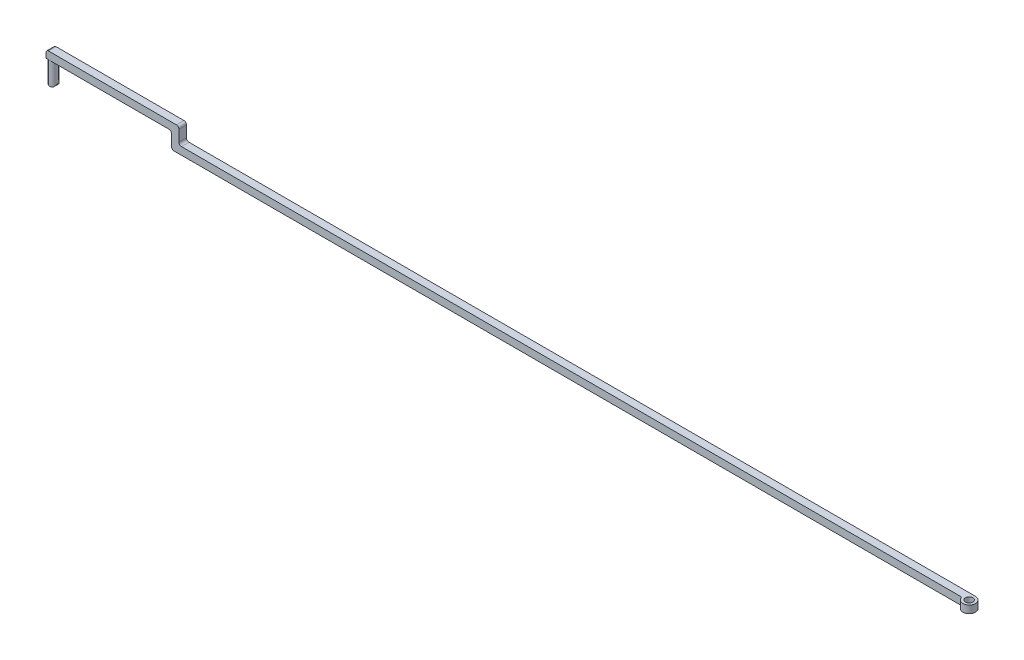
ISO-10303-21;
HEADER;
FILE_DESCRIPTION(('STEP AP214'),'2;1');
FILE_NAME('part.step','',(''),(''),'','','');
FILE_SCHEMA(('AUTOMOTIVE_DESIGN { 1 0 10303 214 1 1 1 1 }'));
ENDSEC;
DATA;
#1=APPLICATION_CONTEXT('core data for automotive mechanical design processes');
#2=APPLICATION_PROTOCOL_DEFINITION('international standard','automotive_design',2000,#1);
#3=PRODUCT_CONTEXT('',#1,'mechanical');
#4=PRODUCT('Part','Part','',(#3));
#5=PRODUCT_RELATED_PRODUCT_CATEGORY('part','',(#4));
#6=PRODUCT_DEFINITION_FORMATION('','',#4);
#7=PRODUCT_DEFINITION_CONTEXT('part definition',#1,'design');
#8=PRODUCT_DEFINITION('design','',#6,#7);
#9=PRODUCT_DEFINITION_SHAPE('','',#8);
#10=(LENGTH_UNIT() NAMED_UNIT(*) SI_UNIT(.MILLI.,.METRE.));
#11=(NAMED_UNIT(*) PLANE_ANGLE_UNIT() SI_UNIT($,.RADIAN.));
#12=(NAMED_UNIT(*) SI_UNIT($,.STERADIAN.) SOLID_ANGLE_UNIT());
#13=UNCERTAINTY_MEASURE_WITH_UNIT(LENGTH_MEASURE(1.E-05),#10,'distance_accuracy_value','');
#14=(GEOMETRIC_REPRESENTATION_CONTEXT(3) GLOBAL_UNCERTAINTY_ASSIGNED_CONTEXT((#13)) GLOBAL_UNIT_ASSIGNED_CONTEXT((#10,
#11,#12)) REPRESENTATION_CONTEXT('',''));
#15=CARTESIAN_POINT('',(0.,0.,0.));
#16=DIRECTION('',(0.,0.,1.));
#17=DIRECTION('',(1.,0.,0.));
#18=AXIS2_PLACEMENT_3D('',#15,#16,#17);
#19=CARTESIAN_POINT('',(-185.,0.,1.5));
#20=DIRECTION('',(1.,0.,0.));
#21=DIRECTION('',(0.,0.,-1.));
#22=AXIS2_PLACEMENT_3D('',#19,#20,#21);
#23=PLANE('',#22);
#24=DIRECTION('',(0.,0.,-1.));
#25=VECTOR('',#24,1.);
#26=CARTESIAN_POINT('',(-185.,4.49999999999999,1.5));
#27=LINE('',#26,#25);
#28=CARTESIAN_POINT('',(-185.,4.49999999999999,1.5));
#29=VERTEX_POINT('',#28);
#30=CARTESIAN_POINT('',(-185.,4.49999999999999,0.75));
#31=VERTEX_POINT('',#30);
#32=EDGE_CURVE('E349',#29,#31,#27,.T.);
#33=ORIENTED_EDGE('',*,*,#32,.F.);
#34=DIRECTION('',(0.,-1.,0.));
#35=VECTOR('',#34,1.);
#36=CARTESIAN_POINT('',(-185.,0.,1.5));
#37=LINE('',#36,#35);
#38=CARTESIAN_POINT('',(-185.,5.49999999999998,1.5));
#39=VERTEX_POINT('',#38);
#40=EDGE_CURVE('E263',#39,#29,#37,.T.);
#41=ORIENTED_EDGE('',*,*,#40,.F.);
#42=DIRECTION('',(0.,0.,1.));
#43=VECTOR('',#42,1.);
#44=CARTESIAN_POINT('',(-185.,5.49999999999998,0.));
#45=LINE('',#44,#43);
#46=CARTESIAN_POINT('',(-185.,5.49999999999998,0.));
#47=VERTEX_POINT('',#46);
#48=EDGE_CURVE('E239',#47,#39,#45,.T.);
#49=ORIENTED_EDGE('',*,*,#48,.F.);
#50=DIRECTION('',(0.,-1.,0.));
#51=VECTOR('',#50,1.);
#52=CARTESIAN_POINT('',(-185.,0.,0.));
#53=LINE('',#52,#51);
#54=CARTESIAN_POINT('',(-185.,4.49999999999999,0.));
#55=VERTEX_POINT('',#54);
#56=EDGE_CURVE('E264',#47,#55,#53,.T.);
#57=ORIENTED_EDGE('',*,*,#56,.T.);
#58=EDGE_CURVE('E346',#31,#55,#27,.T.);
#59=ORIENTED_EDGE('',*,*,#58,.F.);
#60=EDGE_LOOP('',(#33,#41,#49,#57,#59));
#61=FACE_BOUND('',#60,.T.);
#62=ADVANCED_FACE('F34',(#61),#23,.F.);
#63=CARTESIAN_POINT('',(0.,0.,1.5));
#64=DIRECTION('',(0.,0.,1.));
#65=DIRECTION('',(1.,0.,0.));
#66=AXIS2_PLACEMENT_3D('',#63,#64,#65);
#67=PLANE('',#66);
#68=DIRECTION('',(0.,1.,0.));
#69=VECTOR('',#68,1.);
#70=CARTESIAN_POINT('',(-2.44948974278318,-2.28553390593276,1.5));
#71=LINE('',#70,#69);
#72=CARTESIAN_POINT('',(-2.44948974278318,2.74999999999998,1.5));
#73=VERTEX_POINT('',#72);
#74=CARTESIAN_POINT('',(-2.44948974278318,1.24999999999998,1.5));
#75=VERTEX_POINT('',#74);
#76=EDGE_CURVE('E166',#73,#75,#71,.F.);
#77=ORIENTED_EDGE('',*,*,#76,.F.);
#78=DIRECTION('',(-1.,0.,0.));
#79=VECTOR('',#78,1.);
#80=CARTESIAN_POINT('',(-158.,2.74999999999998,1.5));
#81=LINE('',#80,#79);
#82=CARTESIAN_POINT('',(-158.,2.74999999999998,1.5));
#83=VERTEX_POINT('',#82);
#84=EDGE_CURVE('E217',#73,#83,#81,.T.);
#85=ORIENTED_EDGE('',*,*,#84,.T.);
#86=CARTESIAN_POINT('',(-158.,3.24999999999998,1.5));
#87=DIRECTION('',(0.,0.,-1.));
#88=DIRECTION('',(-1.,0.,0.));
#89=AXIS2_PLACEMENT_3D('',#86,#87,#88);
#90=CIRCLE('',#89,0.5);
#91=CARTESIAN_POINT('',(-158.5,3.24999999999998,1.5));
#92=VERTEX_POINT('',#91);
#93=EDGE_CURVE('E219',#83,#92,#90,.T.);
#94=ORIENTED_EDGE('',*,*,#93,.T.);
#95=DIRECTION('',(0.,1.,0.));
#96=VECTOR('',#95,1.);
#97=CARTESIAN_POINT('',(-158.5,5.49999999999998,1.5));
#98=LINE('',#97,#96);
#99=CARTESIAN_POINT('',(-158.5,5.49999999999998,1.5));
#100=VERTEX_POINT('',#99);
#101=EDGE_CURVE('E222',#92,#100,#98,.T.);
#102=ORIENTED_EDGE('',*,*,#101,.T.);
#103=CARTESIAN_POINT('',(-159.,5.49999999999998,1.5));
#104=DIRECTION('',(0.,0.,1.));
#105=DIRECTION('',(-1.,0.,0.));
#106=AXIS2_PLACEMENT_3D('',#103,#104,#105);
#107=CIRCLE('',#106,0.5);
#108=CARTESIAN_POINT('',(-159.,5.99999999999998,1.5));
#109=VERTEX_POINT('',#108);
#110=EDGE_CURVE('E225',#100,#109,#107,.T.);
#111=ORIENTED_EDGE('',*,*,#110,.T.);
#112=DIRECTION('',(-1.,0.,0.));
#113=VECTOR('',#112,1.);
#114=CARTESIAN_POINT('',(0.,6.,1.5));
#115=LINE('',#114,#113);
#116=CARTESIAN_POINT('',(-184.5,5.99999999999998,1.5));
#117=VERTEX_POINT('',#116);
#118=EDGE_CURVE('E260',#109,#117,#115,.T.);
#119=ORIENTED_EDGE('',*,*,#118,.T.);
#120=CARTESIAN_POINT('',(-184.5,5.49999999999998,1.5));
#121=DIRECTION('',(0.,0.,1.));
#122=DIRECTION('',(1.,0.,0.));
#123=AXIS2_PLACEMENT_3D('',#120,#121,#122);
#124=CIRCLE('',#123,0.5);
#125=EDGE_CURVE('E228',#117,#39,#124,.T.);
#126=ORIENTED_EDGE('',*,*,#125,.T.);
#127=ORIENTED_EDGE('',*,*,#40,.T.);
#128=DIRECTION('',(1.,0.,0.));
#129=VECTOR('',#128,1.);
#130=CARTESIAN_POINT('',(0.,4.49999999999999,1.5));
#131=LINE('',#130,#129);
#132=CARTESIAN_POINT('',(-184.25,4.49999999999999,1.5));
#133=VERTEX_POINT('',#132);
#134=EDGE_CURVE('E206',#29,#133,#131,.T.);
#135=ORIENTED_EDGE('',*,*,#134,.T.);
#136=DIRECTION('',(1.,0.,0.));
#137=VECTOR('',#136,1.);
#138=CARTESIAN_POINT('',(-183.,4.49999999999999,1.5));
#139=LINE('',#138,#137);
#140=CARTESIAN_POINT('',(-160.5,4.49999999999999,1.5));
#141=VERTEX_POINT('',#140);
#142=EDGE_CURVE('E203',#133,#141,#139,.T.);
#143=ORIENTED_EDGE('',*,*,#142,.T.);
#144=CARTESIAN_POINT('',(-160.5,3.99999999999999,1.5));
#145=DIRECTION('',(0.,0.,-1.));
#146=DIRECTION('',(1.,0.,0.));
#147=AXIS2_PLACEMENT_3D('',#144,#145,#146);
#148=CIRCLE('',#147,0.5);
#149=CARTESIAN_POINT('',(-160.,3.99999999999999,1.5));
#150=VERTEX_POINT('',#149);
#151=EDGE_CURVE('E205',#141,#150,#148,.T.);
#152=ORIENTED_EDGE('',*,*,#151,.T.);
#153=DIRECTION('',(0.,-1.,0.));
#154=VECTOR('',#153,1.);
#155=CARTESIAN_POINT('',(-160.,1.74999999999998,1.5));
#156=LINE('',#155,#154);
#157=CARTESIAN_POINT('',(-160.,1.74999999999998,1.5));
#158=VERTEX_POINT('',#157);
#159=EDGE_CURVE('E209',#150,#158,#156,.T.);
#160=ORIENTED_EDGE('',*,*,#159,.T.);
#161=CARTESIAN_POINT('',(-159.5,1.74999999999998,1.5));
#162=DIRECTION('',(0.,0.,1.));
#163=DIRECTION('',(-1.,0.,0.));
#164=AXIS2_PLACEMENT_3D('',#161,#162,#163);
#165=CIRCLE('',#164,0.5);
#166=CARTESIAN_POINT('',(-159.5,1.24999999999998,1.5));
#167=VERTEX_POINT('',#166);
#168=EDGE_CURVE('E212',#158,#167,#165,.T.);
#169=ORIENTED_EDGE('',*,*,#168,.T.);
#170=DIRECTION('',(1.,0.,0.));
#171=VECTOR('',#170,1.);
#172=CARTESIAN_POINT('',(-159.5,1.24999999999998,1.5));
#173=LINE('',#172,#171);
#174=EDGE_CURVE('E215',#167,#75,#173,.T.);
#175=ORIENTED_EDGE('',*,*,#174,.T.);
#176=EDGE_LOOP('',(#77,#85,#94,#102,#111,#119,#126,#127,#135,#143,#152,#160,#169,#175));
#177=FACE_BOUND('',#176,.T.);
#178=ADVANCED_FACE('F327',(#177),#67,.T.);
#179=CARTESIAN_POINT('',(0.,0.,0.));
#180=DIRECTION('',(0.,0.,1.));
#181=DIRECTION('',(1.,0.,0.));
#182=AXIS2_PLACEMENT_3D('',#179,#180,#181);
#183=PLANE('',#182);
#184=DIRECTION('',(-1.,0.,0.));
#185=VECTOR('',#184,1.);
#186=CARTESIAN_POINT('',(-158.,2.74999999999998,0.));
#187=LINE('',#186,#185);
#188=CARTESIAN_POINT('',(-1.22474487139159,2.74999999999998,0.));
#189=VERTEX_POINT('',#188);
#190=CARTESIAN_POINT('',(-158.,2.74999999999998,0.));
#191=VERTEX_POINT('',#190);
#192=EDGE_CURVE('E178',#189,#191,#187,.T.);
#193=ORIENTED_EDGE('',*,*,#192,.F.);
#194=DIRECTION('',(0.,1.,0.));
#195=VECTOR('',#194,1.);
#196=CARTESIAN_POINT('',(-1.22474487139159,-1.39353579466759,0.));
#197=LINE('',#196,#195);
#198=CARTESIAN_POINT('',(-1.22474487139159,1.24999999999998,0.));
#199=VERTEX_POINT('',#198);
#200=EDGE_CURVE('E163',#199,#189,#197,.T.);
#201=ORIENTED_EDGE('',*,*,#200,.F.);
#202=DIRECTION('',(1.,0.,0.));
#203=VECTOR('',#202,1.);
#204=CARTESIAN_POINT('',(-159.5,1.24999999999998,0.));
#205=LINE('',#204,#203);
#206=CARTESIAN_POINT('',(-159.5,1.24999999999998,0.));
#207=VERTEX_POINT('',#206);
#208=EDGE_CURVE('E176',#207,#199,#205,.T.);
#209=ORIENTED_EDGE('',*,*,#208,.F.);
#210=CARTESIAN_POINT('',(-159.5,1.74999999999998,0.));
#211=DIRECTION('',(0.,0.,1.));
#212=DIRECTION('',(-1.,0.,0.));
#213=AXIS2_PLACEMENT_3D('',#210,#211,#212);
#214=CIRCLE('',#213,0.5);
#215=CARTESIAN_POINT('',(-160.,1.74999999999998,0.));
#216=VERTEX_POINT('',#215);
#217=EDGE_CURVE('E185',#216,#207,#214,.T.);
#218=ORIENTED_EDGE('',*,*,#217,.F.);
#219=DIRECTION('',(0.,-1.,0.));
#220=VECTOR('',#219,1.);
#221=CARTESIAN_POINT('',(-160.,1.74999999999998,0.));
#222=LINE('',#221,#220);
#223=CARTESIAN_POINT('',(-160.,3.99999999999999,0.));
#224=VERTEX_POINT('',#223);
#225=EDGE_CURVE('E189',#224,#216,#222,.T.);
#226=ORIENTED_EDGE('',*,*,#225,.F.);
#227=CARTESIAN_POINT('',(-160.5,3.99999999999999,0.));
#228=DIRECTION('',(0.,0.,-1.));
#229=DIRECTION('',(1.,0.,0.));
#230=AXIS2_PLACEMENT_3D('',#227,#228,#229);
#231=CIRCLE('',#230,0.5);
#232=CARTESIAN_POINT('',(-160.5,4.49999999999999,0.));
#233=VERTEX_POINT('',#232);
#234=EDGE_CURVE('E352',#233,#224,#231,.T.);
#235=ORIENTED_EDGE('',*,*,#234,.F.);
#236=DIRECTION('',(1.,0.,0.));
#237=VECTOR('',#236,1.);
#238=CARTESIAN_POINT('',(-183.,4.49999999999999,0.));
#239=LINE('',#238,#237);
#240=CARTESIAN_POINT('',(-184.25,4.49999999999999,0.));
#241=VERTEX_POINT('',#240);
#242=EDGE_CURVE('E231',#241,#233,#239,.T.);
#243=ORIENTED_EDGE('',*,*,#242,.F.);
#244=DIRECTION('',(1.,0.,0.));
#245=VECTOR('',#244,1.);
#246=CARTESIAN_POINT('',(0.,4.49999999999999,0.));
#247=LINE('',#246,#245);
#248=EDGE_CURVE('E343',#55,#241,#247,.T.);
#249=ORIENTED_EDGE('',*,*,#248,.F.);
#250=ORIENTED_EDGE('',*,*,#56,.F.);
#251=CARTESIAN_POINT('',(-184.5,5.49999999999998,0.));
#252=DIRECTION('',(0.,0.,1.));
#253=DIRECTION('',(1.,0.,0.));
#254=AXIS2_PLACEMENT_3D('',#251,#252,#253);
#255=CIRCLE('',#254,0.5);
#256=CARTESIAN_POINT('',(-184.5,5.99999999999998,0.));
#257=VERTEX_POINT('',#256);
#258=EDGE_CURVE('E200',#257,#47,#255,.T.);
#259=ORIENTED_EDGE('',*,*,#258,.F.);
#260=DIRECTION('',(-1.,0.,0.));
#261=VECTOR('',#260,1.);
#262=CARTESIAN_POINT('',(0.,6.,0.));
#263=LINE('',#262,#261);
#264=CARTESIAN_POINT('',(-159.,5.99999999999998,0.));
#265=VERTEX_POINT('',#264);
#266=EDGE_CURVE('E235',#265,#257,#263,.T.);
#267=ORIENTED_EDGE('',*,*,#266,.F.);
#268=CARTESIAN_POINT('',(-159.,5.49999999999998,0.));
#269=DIRECTION('',(0.,0.,1.));
#270=DIRECTION('',(-1.,0.,0.));
#271=AXIS2_PLACEMENT_3D('',#268,#269,#270);
#272=CIRCLE('',#271,0.5);
#273=CARTESIAN_POINT('',(-158.5,5.49999999999998,0.));
#274=VERTEX_POINT('',#273);
#275=EDGE_CURVE('E198',#274,#265,#272,.T.);
#276=ORIENTED_EDGE('',*,*,#275,.F.);
#277=DIRECTION('',(0.,1.,0.));
#278=VECTOR('',#277,1.);
#279=CARTESIAN_POINT('',(-158.5,5.49999999999998,0.));
#280=LINE('',#279,#278);
#281=CARTESIAN_POINT('',(-158.5,3.24999999999998,0.));
#282=VERTEX_POINT('',#281);
#283=EDGE_CURVE('E195',#282,#274,#280,.T.);
#284=ORIENTED_EDGE('',*,*,#283,.F.);
#285=CARTESIAN_POINT('',(-158.,3.24999999999998,0.));
#286=DIRECTION('',(0.,0.,-1.));
#287=DIRECTION('',(-1.,0.,0.));
#288=AXIS2_PLACEMENT_3D('',#285,#286,#287);
#289=CIRCLE('',#288,0.5);
#290=EDGE_CURVE('E187',#191,#282,#289,.T.);
#291=ORIENTED_EDGE('',*,*,#290,.F.);
#292=EDGE_LOOP('',(#193,#201,#209,#218,#226,#235,#243,#249,#250,#259,#267,#276,#284,#291));
#293=FACE_BOUND('',#292,.T.);
#294=ADVANCED_FACE('F174',(#293),#183,.F.);
#295=CARTESIAN_POINT('',(0.,6.,1.5));
#296=DIRECTION('',(0.,-1.,0.));
#297=DIRECTION('',(1.,0.,0.));
#298=AXIS2_PLACEMENT_3D('',#295,#296,#297);
#299=PLANE('',#298);
#300=ORIENTED_EDGE('',*,*,#266,.T.);
#301=DIRECTION('',(0.,0.,1.));
#302=VECTOR('',#301,1.);
#303=CARTESIAN_POINT('',(-184.5,5.99999999999998,0.));
#304=LINE('',#303,#302);
#305=EDGE_CURVE('E241',#257,#117,#304,.T.);
#306=ORIENTED_EDGE('',*,*,#305,.T.);
#307=ORIENTED_EDGE('',*,*,#118,.F.);
#308=DIRECTION('',(0.,0.,1.));
#309=VECTOR('',#308,1.);
#310=CARTESIAN_POINT('',(-159.,5.99999999999998,0.));
#311=LINE('',#310,#309);
#312=EDGE_CURVE('E244',#265,#109,#311,.T.);
#313=ORIENTED_EDGE('',*,*,#312,.F.);
#314=EDGE_LOOP('',(#300,#306,#307,#313));
#315=FACE_BOUND('',#314,.T.);
#316=ADVANCED_FACE('F36',(#315),#299,.F.);
#317=CARTESIAN_POINT('',(-183.,4.49999999999999,0.));
#318=DIRECTION('',(0.,-1.,0.));
#319=DIRECTION('',(0.,0.,-1.));
#320=AXIS2_PLACEMENT_3D('',#317,#318,#319);
#321=PLANE('',#320);
#322=DIRECTION('',(0.,0.,1.));
#323=VECTOR('',#322,1.);
#324=CARTESIAN_POINT('',(-160.5,4.49999999999999,0.));
#325=LINE('',#324,#323);
#326=EDGE_CURVE('E202',#233,#141,#325,.T.);
#327=ORIENTED_EDGE('',*,*,#326,.T.);
#328=ORIENTED_EDGE('',*,*,#142,.F.);
#329=CARTESIAN_POINT('',(-184.25,4.49999999999999,0.75));
#330=DIRECTION('',(0.,-1.,0.));
#331=DIRECTION('',(0.,0.,-1.));
#332=AXIS2_PLACEMENT_3D('',#329,#330,#331);
#333=CIRCLE('',#332,0.750000000000012);
#334=EDGE_CURVE('E371',#133,#241,#333,.F.);
#335=ORIENTED_EDGE('',*,*,#334,.T.);
#336=ORIENTED_EDGE('',*,*,#242,.T.);
#337=EDGE_LOOP('',(#327,#328,#335,#336));
#338=FACE_BOUND('',#337,.T.);
#339=ADVANCED_FACE('F317',(#338),#321,.T.);
#340=CARTESIAN_POINT('',(-160.5,3.99999999999999,0.));
#341=DIRECTION('',(0.,0.,1.));
#342=DIRECTION('',(1.,0.,0.));
#343=AXIS2_PLACEMENT_3D('',#340,#341,#342);
#344=CYLINDRICAL_SURFACE('',#343,0.5);
#345=ORIENTED_EDGE('',*,*,#151,.F.);
#346=ORIENTED_EDGE('',*,*,#326,.F.);
#347=ORIENTED_EDGE('',*,*,#234,.T.);
#348=DIRECTION('',(0.,0.,1.));
#349=VECTOR('',#348,1.);
#350=CARTESIAN_POINT('',(-160.,3.99999999999999,0.));
#351=LINE('',#350,#349);
#352=EDGE_CURVE('E256',#224,#150,#351,.T.);
#353=ORIENTED_EDGE('',*,*,#352,.T.);
#354=EDGE_LOOP('',(#345,#346,#347,#353));
#355=FACE_BOUND('',#354,.T.);
#356=ADVANCED_FACE('F313',(#355),#344,.F.);
#357=CARTESIAN_POINT('',(-160.,1.74999999999998,0.));
#358=DIRECTION('',(-1.,0.,0.));
#359=DIRECTION('',(0.,0.,1.));
#360=AXIS2_PLACEMENT_3D('',#357,#358,#359);
#361=PLANE('',#360);
#362=ORIENTED_EDGE('',*,*,#159,.F.);
#363=ORIENTED_EDGE('',*,*,#352,.F.);
#364=ORIENTED_EDGE('',*,*,#225,.T.);
#365=DIRECTION('',(0.,0.,1.));
#366=VECTOR('',#365,1.);
#367=CARTESIAN_POINT('',(-160.,1.74999999999998,0.));
#368=LINE('',#367,#366);
#369=EDGE_CURVE('E254',#216,#158,#368,.T.);
#370=ORIENTED_EDGE('',*,*,#369,.T.);
#371=EDGE_LOOP('',(#362,#363,#364,#370));
#372=FACE_BOUND('',#371,.T.);
#373=ADVANCED_FACE('F309',(#372),#361,.T.);
#374=CARTESIAN_POINT('',(-159.5,1.74999999999998,0.));
#375=DIRECTION('',(0.,0.,1.));
#376=DIRECTION('',(1.,0.,0.));
#377=AXIS2_PLACEMENT_3D('',#374,#375,#376);
#378=CYLINDRICAL_SURFACE('',#377,0.5);
#379=ORIENTED_EDGE('',*,*,#168,.F.);
#380=ORIENTED_EDGE('',*,*,#369,.F.);
#381=ORIENTED_EDGE('',*,*,#217,.T.);
#382=DIRECTION('',(0.,0.,1.));
#383=VECTOR('',#382,1.);
#384=CARTESIAN_POINT('',(-159.5,1.24999999999998,0.));
#385=LINE('',#384,#383);
#386=EDGE_CURVE('E183',#207,#167,#385,.T.);
#387=ORIENTED_EDGE('',*,*,#386,.T.);
#388=EDGE_LOOP('',(#379,#380,#381,#387));
#389=FACE_BOUND('',#388,.T.);
#390=ADVANCED_FACE('F306',(#389),#378,.T.);
#391=CARTESIAN_POINT('',(-159.5,1.24999999999998,0.));
#392=DIRECTION('',(0.,-1.,0.));
#393=DIRECTION('',(1.,0.,0.));
#394=AXIS2_PLACEMENT_3D('',#391,#392,#393);
#395=PLANE('',#394);
#396=ORIENTED_EDGE('',*,*,#208,.T.);
#397=CARTESIAN_POINT('',(-1.22474487139159,1.24999999999998,1.25));
#398=DIRECTION('',(0.,-1.,0.));
#399=DIRECTION('',(1.,0.,0.));
#400=AXIS2_PLACEMENT_3D('',#397,#398,#399);
#401=CIRCLE('',#400,1.25);
#402=EDGE_CURVE('E160',#75,#199,#401,.F.);
#403=ORIENTED_EDGE('',*,*,#402,.F.);
#404=ORIENTED_EDGE('',*,*,#174,.F.);
#405=ORIENTED_EDGE('',*,*,#386,.F.);
#406=EDGE_LOOP('',(#396,#403,#404,#405));
#407=FACE_BOUND('',#406,.T.);
#408=CARTESIAN_POINT('',(-1.22474487139159,1.24999999999998,1.25));
#409=DIRECTION('',(0.,-1.,0.));
#410=DIRECTION('',(1.,0.,0.));
#411=AXIS2_PLACEMENT_3D('',#408,#409,#410);
#412=CIRCLE('',#411,0.75);
#413=CARTESIAN_POINT('',(-0.474744871391589,1.24999999999998,1.25));
#414=VERTEX_POINT('',#413);
#415=EDGE_CURVE('E382',#414,#414,#412,.F.);
#416=ORIENTED_EDGE('',*,*,#415,.T.);
#417=EDGE_LOOP('',(#416));
#418=FACE_BOUND('',#417,.T.);
#419=ADVANCED_FACE('F181',(#407,#418),#395,.T.);
#420=CARTESIAN_POINT('',(-158.,2.74999999999998,0.));
#421=DIRECTION('',(0.,1.,0.));
#422=DIRECTION('',(-1.,0.,0.));
#423=AXIS2_PLACEMENT_3D('',#420,#421,#422);
#424=PLANE('',#423);
#425=CARTESIAN_POINT('',(-1.22474487139159,2.74999999999998,1.25));
#426=DIRECTION('',(0.,1.,0.));
#427=DIRECTION('',(0.,0.,1.));
#428=AXIS2_PLACEMENT_3D('',#425,#426,#427);
#429=CIRCLE('',#428,1.25);
#430=EDGE_CURVE('E54',#73,#189,#429,.T.);
#431=ORIENTED_EDGE('',*,*,#430,.T.);
#432=ORIENTED_EDGE('',*,*,#192,.T.);
#433=DIRECTION('',(0.,0.,1.));
#434=VECTOR('',#433,1.);
#435=CARTESIAN_POINT('',(-158.,2.74999999999998,0.));
#436=LINE('',#435,#434);
#437=EDGE_CURVE('E250',#191,#83,#436,.T.);
#438=ORIENTED_EDGE('',*,*,#437,.T.);
#439=ORIENTED_EDGE('',*,*,#84,.F.);
#440=EDGE_LOOP('',(#431,#432,#438,#439));
#441=FACE_BOUND('',#440,.T.);
#442=CARTESIAN_POINT('',(-1.22474487139159,2.74999999999998,1.25));
#443=DIRECTION('',(0.,1.,0.));
#444=DIRECTION('',(0.,0.,1.));
#445=AXIS2_PLACEMENT_3D('',#442,#443,#444);
#446=CIRCLE('',#445,0.75);
#447=CARTESIAN_POINT('',(-1.22474487139159,2.74999999999998,2.));
#448=VERTEX_POINT('',#447);
#449=EDGE_CURVE('E179',#448,#448,#446,.T.);
#450=ORIENTED_EDGE('',*,*,#449,.F.);
#451=EDGE_LOOP('',(#450));
#452=FACE_BOUND('',#451,.T.);
#453=ADVANCED_FACE('F300',(#441,#452),#424,.T.);
#454=CARTESIAN_POINT('',(-158.,3.24999999999998,0.));
#455=DIRECTION('',(0.,0.,1.));
#456=DIRECTION('',(1.,0.,0.));
#457=AXIS2_PLACEMENT_3D('',#454,#455,#456);
#458=CYLINDRICAL_SURFACE('',#457,0.5);
#459=ORIENTED_EDGE('',*,*,#93,.F.);
#460=ORIENTED_EDGE('',*,*,#437,.F.);
#461=ORIENTED_EDGE('',*,*,#290,.T.);
#462=DIRECTION('',(0.,0.,1.));
#463=VECTOR('',#462,1.);
#464=CARTESIAN_POINT('',(-158.5,3.24999999999998,0.));
#465=LINE('',#464,#463);
#466=EDGE_CURVE('E248',#282,#92,#465,.T.);
#467=ORIENTED_EDGE('',*,*,#466,.T.);
#468=EDGE_LOOP('',(#459,#460,#461,#467));
#469=FACE_BOUND('',#468,.T.);
#470=ADVANCED_FACE('F296',(#469),#458,.F.);
#471=CARTESIAN_POINT('',(-158.5,5.49999999999998,0.));
#472=DIRECTION('',(1.,0.,0.));
#473=DIRECTION('',(0.,0.,-1.));
#474=AXIS2_PLACEMENT_3D('',#471,#472,#473);
#475=PLANE('',#474);
#476=ORIENTED_EDGE('',*,*,#101,.F.);
#477=ORIENTED_EDGE('',*,*,#466,.F.);
#478=ORIENTED_EDGE('',*,*,#283,.T.);
#479=DIRECTION('',(0.,0.,1.));
#480=VECTOR('',#479,1.);
#481=CARTESIAN_POINT('',(-158.5,5.49999999999998,0.));
#482=LINE('',#481,#480);
#483=EDGE_CURVE('E246',#274,#100,#482,.T.);
#484=ORIENTED_EDGE('',*,*,#483,.T.);
#485=EDGE_LOOP('',(#476,#477,#478,#484));
#486=FACE_BOUND('',#485,.T.);
#487=ADVANCED_FACE('F292',(#486),#475,.T.);
#488=CARTESIAN_POINT('',(-159.,5.49999999999998,0.));
#489=DIRECTION('',(0.,0.,1.));
#490=DIRECTION('',(1.,0.,0.));
#491=AXIS2_PLACEMENT_3D('',#488,#489,#490);
#492=CYLINDRICAL_SURFACE('',#491,0.5);
#493=ORIENTED_EDGE('',*,*,#110,.F.);
#494=ORIENTED_EDGE('',*,*,#483,.F.);
#495=ORIENTED_EDGE('',*,*,#275,.T.);
#496=ORIENTED_EDGE('',*,*,#312,.T.);
#497=EDGE_LOOP('',(#493,#494,#495,#496));
#498=FACE_BOUND('',#497,.T.);
#499=ADVANCED_FACE('F288',(#498),#492,.T.);
#500=CARTESIAN_POINT('',(-184.5,5.49999999999998,0.));
#501=DIRECTION('',(0.,0.,1.));
#502=DIRECTION('',(1.,0.,0.));
#503=AXIS2_PLACEMENT_3D('',#500,#501,#502);
#504=CYLINDRICAL_SURFACE('',#503,0.5);
#505=ORIENTED_EDGE('',*,*,#125,.F.);
#506=ORIENTED_EDGE('',*,*,#305,.F.);
#507=ORIENTED_EDGE('',*,*,#258,.T.);
#508=ORIENTED_EDGE('',*,*,#48,.T.);
#509=EDGE_LOOP('',(#505,#506,#507,#508));
#510=FACE_BOUND('',#509,.T.);
#511=ADVANCED_FACE('F283',(#510),#504,.T.);
#512=ORIENTED_EDGE('',*,*,#58,.T.);
#513=ORIENTED_EDGE('',*,*,#248,.T.);
#514=EDGE_CURVE('E368',#241,#31,#333,.F.);
#515=ORIENTED_EDGE('',*,*,#514,.T.);
#516=EDGE_LOOP('',(#512,#513,#515));
#517=FACE_BOUND('',#516,.T.);
#518=ADVANCED_FACE('F287',(#517),#321,.T.);
#519=ORIENTED_EDGE('',*,*,#32,.T.);
#520=EDGE_CURVE('E375',#31,#133,#333,.F.);
#521=ORIENTED_EDGE('',*,*,#520,.T.);
#522=ORIENTED_EDGE('',*,*,#134,.F.);
#523=EDGE_LOOP('',(#519,#521,#522));
#524=FACE_BOUND('',#523,.T.);
#525=ADVANCED_FACE('F322',(#524),#321,.T.);
#526=CARTESIAN_POINT('',(-184.25,7.43345519992473,0.75));
#527=DIRECTION('',(0.,-1.,0.));
#528=DIRECTION('',(1.,0.,0.));
#529=AXIS2_PLACEMENT_3D('',#526,#527,#528);
#530=CYLINDRICAL_SURFACE('',#529,0.750000000000012);
#531=CARTESIAN_POINT('',(-184.5,0.,0.0428932188134401));
#532=CARTESIAN_POINT('',(-184.528245430534,-1.23770222548953E-05,0.0528406877617057));
#533=CARTESIAN_POINT('',(-184.555731737836,0.00238736721127537,0.0644968810700047));
#534=CARTESIAN_POINT('',(-184.608371404753,0.011169356403913,0.0905245217038318));
#535=CARTESIAN_POINT('',(-184.633545978836,0.0175100960096974,0.104866595948954));
#536=CARTESIAN_POINT('',(-184.686805777821,0.0351730577703046,0.139319787417969));
#537=CARTESIAN_POINT('',(-184.714245589784,0.0473015302541364,0.160000655078653));
#538=CARTESIAN_POINT('',(-184.76515730661,0.0751035270828731,0.203878753223102));
#539=CARTESIAN_POINT('',(-184.788610780338,0.0907927747782096,0.227086899551244));
#540=CARTESIAN_POINT('',(-184.839818528929,0.131268041625801,0.284579344961498));
#541=CARTESIAN_POINT('',(-184.865727795389,0.15722544832907,0.319675837114897));
#542=CARTESIAN_POINT('',(-184.910381111897,0.212175655728016,0.391942234091988));
#543=CARTESIAN_POINT('',(-184.929115301777,0.241172564224634,0.429114912304798));
#544=CARTESIAN_POINT('',(-184.963020681627,0.307009651980546,0.512293156494026));
#545=CARTESIAN_POINT('',(-184.976719827053,0.344255167583803,0.558572869252158));
#546=CARTESIAN_POINT('',(-184.995061263617,0.419860270072513,0.651840456634544));
#547=CARTESIAN_POINT('',(-184.999722809603,0.458217311343547,0.698826610301603));
#548=CARTESIAN_POINT('',(-184.999995991457,0.497690642372255,0.747171625117736));
#549=CARTESIAN_POINT('',(-184.999999990556,0.498845347310677,0.748585843978667));
#550=CARTESIAN_POINT('',(-185.,0.499999999999999,0.75));
#551=B_SPLINE_CURVE_WITH_KNOTS('',3,(#531,#532,#533,#534,#535,#536,#537,#538,#539,#540,#541,
#542,#543,#544,#545,#546,#547,#548,#549,#550),.UNSPECIFIED.,.F.,.F.,(4,2,2,2,2,2,2,2,2,4),(0.,
0.0894666674527616,0.178006702474038,0.286737649510842,0.395958399065818,0.547422457107253,
0.699093920280539,0.881237695450008,1.06299298014536,1.06847021886662),.UNSPECIFIED.);
#552=CARTESIAN_POINT('',(-185.,0.499999999999999,0.75));
#553=VERTEX_POINT('',#552);
#554=CARTESIAN_POINT('',(-184.5,0.,0.0428932188134519));
#555=VERTEX_POINT('',#554);
#556=EDGE_CURVE('E47',#553,#555,#551,.F.);
#557=ORIENTED_EDGE('',*,*,#556,.F.);
#558=CARTESIAN_POINT('',(-184.5,0.,1.45710678118656));
#559=CARTESIAN_POINT('',(-184.528245430534,-1.23770222548093E-05,1.44715931223829));
#560=CARTESIAN_POINT('',(-184.555731737836,0.00238736721127545,1.43550311893));
#561=CARTESIAN_POINT('',(-184.608371404753,0.011169356403913,1.40947547829617));
#562=CARTESIAN_POINT('',(-184.633545978836,0.0175100960096974,1.39513340405105));
#563=CARTESIAN_POINT('',(-184.686805777821,0.0351730577703046,1.36068021258203));
#564=CARTESIAN_POINT('',(-184.714245589784,0.0473015302541364,1.33999934492135));
#565=CARTESIAN_POINT('',(-184.76515730661,0.0751035270828732,1.2961212467769));
#566=CARTESIAN_POINT('',(-184.788610780338,0.0907927747782096,1.27291310044876));
#567=CARTESIAN_POINT('',(-184.839818528929,0.131268041625801,1.2154206550385));
#568=CARTESIAN_POINT('',(-184.865727795389,0.15722544832907,1.1803241628851));
#569=CARTESIAN_POINT('',(-184.910381111897,0.212175655728016,1.10805776590801));
#570=CARTESIAN_POINT('',(-184.929115301777,0.241172564224634,1.0708850876952));
#571=CARTESIAN_POINT('',(-184.963020681627,0.307009651980546,0.987706843505974));
#572=CARTESIAN_POINT('',(-184.976719827053,0.344255167583804,0.94142713074784));
#573=CARTESIAN_POINT('',(-184.995061263617,0.419860270072515,0.848159543365454));
#574=CARTESIAN_POINT('',(-184.999722809603,0.458217311343548,0.801173389698396));
#575=CARTESIAN_POINT('',(-184.999995991457,0.497690642372255,0.752828374882264));
#576=CARTESIAN_POINT('',(-184.999999990556,0.498845347310677,0.751414156021333));
#577=CARTESIAN_POINT('',(-185.,0.499999999999999,0.75));
#578=B_SPLINE_CURVE_WITH_KNOTS('',3,(#558,#559,#560,#561,#562,#563,#564,#565,#566,#567,#568,
#569,#570,#571,#572,#573,#574,#575,#576,#577),.UNSPECIFIED.,.F.,.F.,(4,2,2,2,2,2,2,2,2,4),(0.,
0.0894666674527617,0.178006702474038,0.286737649510842,0.395958399065818,0.547422457107253,
0.699093920280539,0.881237695450012,1.06299298014536,1.06847021886662),.UNSPECIFIED.);
#579=CARTESIAN_POINT('',(-184.5,0.,1.45710678118655));
#580=VERTEX_POINT('',#579);
#581=EDGE_CURVE('E12',#580,#553,#578,.T.);
#582=ORIENTED_EDGE('',*,*,#581,.F.);
#583=CARTESIAN_POINT('',(-184.25,0.,0.75));
#584=DIRECTION('',(0.,-1.,0.));
#585=DIRECTION('',(1.,0.,0.));
#586=AXIS2_PLACEMENT_3D('',#583,#584,#585);
#587=CIRCLE('',#586,0.750000000000012);
#588=CARTESIAN_POINT('',(-184.,0.,1.45710678118656));
#589=VERTEX_POINT('',#588);
#590=EDGE_CURVE('E376',#589,#580,#587,.T.);
#591=ORIENTED_EDGE('',*,*,#590,.F.);
#592=CARTESIAN_POINT('',(-184.,0.,1.45710678118656));
#593=CARTESIAN_POINT('',(-183.971754569466,-1.23770222550983E-05,1.44715931223829));
#594=CARTESIAN_POINT('',(-183.944268262164,0.00238736721127705,1.43550311892999));
#595=CARTESIAN_POINT('',(-183.891628595247,0.0111693564039178,1.40947547829616));
#596=CARTESIAN_POINT('',(-183.866454021164,0.0175100960097006,1.39513340405104));
#597=CARTESIAN_POINT('',(-183.813194222179,0.0351730577703039,1.36068021258203));
#598=CARTESIAN_POINT('',(-183.785754410216,0.0473015302541342,1.33999934492135));
#599=CARTESIAN_POINT('',(-183.73484269339,0.0751035270828729,1.2961212467769));
#600=CARTESIAN_POINT('',(-183.711389219662,0.090792774778213,1.27291310044876));
#601=CARTESIAN_POINT('',(-183.660181471071,0.131268041625798,1.2154206550385));
#602=CARTESIAN_POINT('',(-183.634272204611,0.157225448329048,1.18032416288508));
#603=CARTESIAN_POINT('',(-183.589618888103,0.212175655728046,1.10805776590803));
#604=CARTESIAN_POINT('',(-183.570884698223,0.241172564224731,1.07088508769528));
#605=CARTESIAN_POINT('',(-183.536979318373,0.307009651980429,0.987706843505888));
#606=CARTESIAN_POINT('',(-183.523280172947,0.344255167583332,0.941427130747472));
#607=CARTESIAN_POINT('',(-183.504938736383,0.419860270072981,0.848159543365847));
#608=CARTESIAN_POINT('',(-183.500277190397,0.458217311345305,0.801173389699832));
#609=CARTESIAN_POINT('',(-183.500004008543,0.497690642372363,0.752828374882346));
#610=CARTESIAN_POINT('',(-183.500000009444,0.498845347310732,0.751414156021375));
#611=CARTESIAN_POINT('',(-183.5,0.499999999999999,0.75));
#612=B_SPLINE_CURVE_WITH_KNOTS('',3,(#592,#593,#594,#595,#596,#597,#598,#599,#600,#601,#602,
#603,#604,#605,#606,#607,#608,#609,#610,#611),.UNSPECIFIED.,.F.,.F.,(4,2,2,2,2,2,2,2,2,4),(0.,
0.0894666674527926,0.178006702474038,0.286737649510839,0.395958399065817,0.54742245710726,
0.699093920280537,0.881237695449995,1.06299298014537,1.06847021886662),.UNSPECIFIED.);
#613=CARTESIAN_POINT('',(-183.5,0.499999999999999,0.75));
#614=VERTEX_POINT('',#613);
#615=EDGE_CURVE('E331',#614,#589,#612,.F.);
#616=ORIENTED_EDGE('',*,*,#615,.F.);
#617=CARTESIAN_POINT('',(-184.,0.,0.0428932188134401));
#618=CARTESIAN_POINT('',(-183.971754569466,-1.23770222550767E-05,0.052840687761709));
#619=CARTESIAN_POINT('',(-183.944268262164,0.00238736721127708,0.0644968810700124));
#620=CARTESIAN_POINT('',(-183.891628595247,0.0111693564039178,0.0905245217038411));
#621=CARTESIAN_POINT('',(-183.866454021164,0.0175100960097006,0.104866595948958));
#622=CARTESIAN_POINT('',(-183.813194222179,0.0351730577703039,0.139319787417967));
#623=CARTESIAN_POINT('',(-183.785754410216,0.0473015302541342,0.16000065507865));
#624=CARTESIAN_POINT('',(-183.73484269339,0.0751035270828729,0.203878753223097));
#625=CARTESIAN_POINT('',(-183.711389219662,0.0907927747782129,0.227086899551238));
#626=CARTESIAN_POINT('',(-183.660181471071,0.131268041625798,0.284579344961503));
#627=CARTESIAN_POINT('',(-183.634272204611,0.157225448329049,0.31967583711492));
#628=CARTESIAN_POINT('',(-183.589618888103,0.212175655728046,0.39194223409197));
#629=CARTESIAN_POINT('',(-183.570884698223,0.24117256422473,0.42911491230472));
#630=CARTESIAN_POINT('',(-183.536979318373,0.307009651980431,0.512293156494112));
#631=CARTESIAN_POINT('',(-183.523280172947,0.344255167583338,0.558572869252527));
#632=CARTESIAN_POINT('',(-183.504938736383,0.419860270072979,0.651840456634159));
#633=CARTESIAN_POINT('',(-183.500277190397,0.45821731134529,0.698826610300183));
#634=CARTESIAN_POINT('',(-183.500004008543,0.497690642372362,0.747171625117655));
#635=CARTESIAN_POINT('',(-183.500000009444,0.498845347310732,0.748585843978626));
#636=CARTESIAN_POINT('',(-183.5,0.499999999999999,0.75));
#637=B_SPLINE_CURVE_WITH_KNOTS('',3,(#617,#618,#619,#620,#621,#622,#623,#624,#625,#626,#627,
#628,#629,#630,#631,#632,#633,#634,#635,#636),.UNSPECIFIED.,.F.,.F.,(4,2,2,2,2,2,2,2,2,4),(0.,
0.0894666674527925,0.178006702474038,0.286737649510839,0.395958399065817,0.54742245710726,
0.699093920280537,0.881237695449999,1.06299298014537,1.06847021886662),.UNSPECIFIED.);
#638=CARTESIAN_POINT('',(-184.,0.,0.0428932188134401));
#639=VERTEX_POINT('',#638);
#640=EDGE_CURVE('E337',#639,#614,#637,.T.);
#641=ORIENTED_EDGE('',*,*,#640,.F.);
#642=EDGE_CURVE('E62',#555,#639,#587,.T.);
#643=ORIENTED_EDGE('',*,*,#642,.F.);
#644=EDGE_LOOP('',(#557,#582,#591,#616,#641,#643));
#645=FACE_BOUND('',#644,.T.);
#646=ORIENTED_EDGE('',*,*,#520,.F.);
#647=ORIENTED_EDGE('',*,*,#514,.F.);
#648=ORIENTED_EDGE('',*,*,#334,.F.);
#649=EDGE_LOOP('',(#646,#647,#648));
#650=FACE_BOUND('',#649,.T.);
#651=ADVANCED_FACE('F273',(#645,#650),#530,.T.);
#652=CARTESIAN_POINT('',(-184.,0.5,0.));
#653=DIRECTION('',(0.,0.,1.));
#654=DIRECTION('',(1.,0.,0.));
#655=AXIS2_PLACEMENT_3D('',#652,#653,#654);
#656=CYLINDRICAL_SURFACE('',#655,0.5);
#657=DIRECTION('',(0.,0.,1.));
#658=VECTOR('',#657,1.);
#659=CARTESIAN_POINT('',(-184.,0.,0.));
#660=LINE('',#659,#658);
#661=EDGE_CURVE('E232',#639,#589,#660,.T.);
#662=ORIENTED_EDGE('',*,*,#661,.F.);
#663=ORIENTED_EDGE('',*,*,#640,.T.);
#664=ORIENTED_EDGE('',*,*,#615,.T.);
#665=EDGE_LOOP('',(#662,#663,#664));
#666=FACE_BOUND('',#665,.T.);
#667=ADVANCED_FACE('F281',(#666),#656,.T.);
#668=CARTESIAN_POINT('',(-184.5,0.5,0.));
#669=DIRECTION('',(0.,0.,1.));
#670=DIRECTION('',(1.,0.,0.));
#671=AXIS2_PLACEMENT_3D('',#668,#669,#670);
#672=CYLINDRICAL_SURFACE('',#671,0.5);
#673=DIRECTION('',(0.,0.,1.));
#674=VECTOR('',#673,1.);
#675=CARTESIAN_POINT('',(-184.5,0.,0.));
#676=LINE('',#675,#674);
#677=EDGE_CURVE('E236',#555,#580,#676,.T.);
#678=ORIENTED_EDGE('',*,*,#677,.T.);
#679=ORIENTED_EDGE('',*,*,#581,.T.);
#680=ORIENTED_EDGE('',*,*,#556,.T.);
#681=EDGE_LOOP('',(#678,#679,#680));
#682=FACE_BOUND('',#681,.T.);
#683=ADVANCED_FACE('F276',(#682),#672,.T.);
#684=CARTESIAN_POINT('',(0.,0.,1.5));
#685=DIRECTION('',(0.,1.,0.));
#686=DIRECTION('',(-1.,0.,0.));
#687=AXIS2_PLACEMENT_3D('',#684,#685,#686);
#688=PLANE('',#687);
#689=ORIENTED_EDGE('',*,*,#590,.T.);
#690=ORIENTED_EDGE('',*,*,#677,.F.);
#691=ORIENTED_EDGE('',*,*,#642,.T.);
#692=ORIENTED_EDGE('',*,*,#661,.T.);
#693=EDGE_LOOP('',(#689,#690,#691,#692));
#694=FACE_BOUND('',#693,.T.);
#695=ADVANCED_FACE('F280',(#694),#688,.F.);
#696=CARTESIAN_POINT('',(-1.22474487139159,-2.28553390593276,1.25));
#697=DIRECTION('',(0.,1.,0.));
#698=DIRECTION('',(0.,0.,1.));
#699=AXIS2_PLACEMENT_3D('',#696,#697,#698);
#700=CYLINDRICAL_SURFACE('',#699,1.25);
#701=ORIENTED_EDGE('',*,*,#402,.T.);
#702=ORIENTED_EDGE('',*,*,#200,.T.);
#703=ORIENTED_EDGE('',*,*,#430,.F.);
#704=ORIENTED_EDGE('',*,*,#76,.T.);
#705=EDGE_LOOP('',(#701,#702,#703,#704));
#706=FACE_BOUND('',#705,.T.);
#707=ADVANCED_FACE('F162',(#706),#700,.T.);
#708=CARTESIAN_POINT('',(-1.22474487139159,-1.39353579466759,1.25));
#709=DIRECTION('',(0.,1.,0.));
#710=DIRECTION('',(0.,0.,1.));
#711=AXIS2_PLACEMENT_3D('',#708,#709,#710);
#712=CYLINDRICAL_SURFACE('',#711,0.75);
#713=ORIENTED_EDGE('',*,*,#449,.T.);
#714=EDGE_LOOP('',(#713));
#715=FACE_BOUND('',#714,.T.);
#716=ORIENTED_EDGE('',*,*,#415,.F.);
#717=EDGE_LOOP('',(#716));
#718=FACE_BOUND('',#717,.T.);
#719=ADVANCED_FACE('F388',(#715,#718),#712,.F.);
#720=CLOSED_SHELL('',(#62,#178,#294,#316,#339,#356,#373,#390,#419,#453,#470,#487,#499,#511,#518,
#525,#651,#667,#683,#695,#707,#719));
#721=MANIFOLD_SOLID_BREP('B2',#720);
#722=ADVANCED_BREP_SHAPE_REPRESENTATION('',(#18,#721),#14);
#723=SHAPE_DEFINITION_REPRESENTATION(#9,#722);
ENDSEC;
END-ISO-10303-21;
